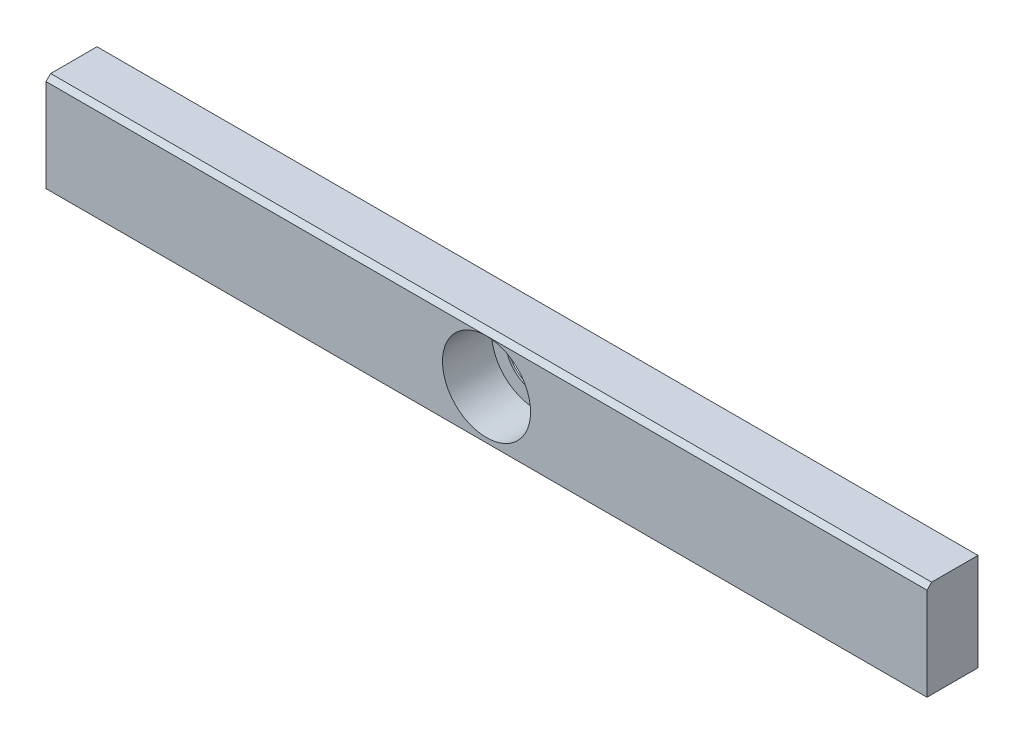
ISO-10303-21;
HEADER;
FILE_DESCRIPTION(('STEP AP214'),'2;1');
FILE_NAME('part.step','',(''),(''),'','','');
FILE_SCHEMA(('AUTOMOTIVE_DESIGN { 1 0 10303 214 1 1 1 1 }'));
ENDSEC;
DATA;
#1=APPLICATION_CONTEXT('core data for automotive mechanical design processes');
#2=APPLICATION_PROTOCOL_DEFINITION('international standard','automotive_design',2000,#1);
#3=PRODUCT_CONTEXT('',#1,'mechanical');
#4=PRODUCT('Part','Part','',(#3));
#5=PRODUCT_RELATED_PRODUCT_CATEGORY('part','',(#4));
#6=PRODUCT_DEFINITION_FORMATION('','',#4);
#7=PRODUCT_DEFINITION_CONTEXT('part definition',#1,'design');
#8=PRODUCT_DEFINITION('design','',#6,#7);
#9=PRODUCT_DEFINITION_SHAPE('','',#8);
#10=(LENGTH_UNIT() NAMED_UNIT(*) SI_UNIT(.MILLI.,.METRE.));
#11=(NAMED_UNIT(*) PLANE_ANGLE_UNIT() SI_UNIT($,.RADIAN.));
#12=(NAMED_UNIT(*) SI_UNIT($,.STERADIAN.) SOLID_ANGLE_UNIT());
#13=UNCERTAINTY_MEASURE_WITH_UNIT(LENGTH_MEASURE(1.E-05),#10,'distance_accuracy_value','');
#14=(GEOMETRIC_REPRESENTATION_CONTEXT(3) GLOBAL_UNCERTAINTY_ASSIGNED_CONTEXT((#13)) GLOBAL_UNIT_ASSIGNED_CONTEXT((#10,
#11,#12)) REPRESENTATION_CONTEXT('',''));
#15=CARTESIAN_POINT('',(0.,0.,0.));
#16=DIRECTION('',(0.,0.,1.));
#17=DIRECTION('',(1.,0.,0.));
#18=AXIS2_PLACEMENT_3D('',#15,#16,#17);
#19=CARTESIAN_POINT('',(475.,52.5,27.5));
#20=DIRECTION('',(-1.,0.,0.));
#21=DIRECTION('',(0.,0.,1.));
#22=AXIS2_PLACEMENT_3D('',#19,#20,#21);
#23=PLANE('',#22);
#24=DIRECTION('',(0.,0.,-1.));
#25=VECTOR('',#24,1.);
#26=CARTESIAN_POINT('',(475.,52.5,27.5));
#27=LINE('',#26,#25);
#28=CARTESIAN_POINT('',(475.,52.5,22.5));
#29=VERTEX_POINT('',#28);
#30=CARTESIAN_POINT('',(475.,52.5,-27.5));
#31=VERTEX_POINT('',#30);
#32=EDGE_CURVE('E122',#29,#31,#27,.T.);
#33=ORIENTED_EDGE('',*,*,#32,.F.);
#34=DIRECTION('',(0.,-0.70710678118654,0.707106781186555));
#35=VECTOR('',#34,1.);
#36=CARTESIAN_POINT('',(475.,47.5000000000001,27.5));
#37=LINE('',#36,#35);
#38=CARTESIAN_POINT('',(475.,47.5000000000001,27.5));
#39=VERTEX_POINT('',#38);
#40=EDGE_CURVE('E11',#29,#39,#37,.T.);
#41=ORIENTED_EDGE('',*,*,#40,.T.);
#42=DIRECTION('',(0.,1.,0.));
#43=VECTOR('',#42,1.);
#44=CARTESIAN_POINT('',(475.,52.5,27.5));
#45=LINE('',#44,#43);
#46=CARTESIAN_POINT('',(475.,-52.5,27.5));
#47=VERTEX_POINT('',#46);
#48=EDGE_CURVE('E92',#47,#39,#45,.T.);
#49=ORIENTED_EDGE('',*,*,#48,.F.);
#50=DIRECTION('',(0.,0.,-1.));
#51=VECTOR('',#50,1.);
#52=CARTESIAN_POINT('',(475.,-52.5,27.5));
#53=LINE('',#52,#51);
#54=CARTESIAN_POINT('',(475.,-52.5,-27.5));
#55=VERTEX_POINT('',#54);
#56=EDGE_CURVE('E102',#47,#55,#53,.T.);
#57=ORIENTED_EDGE('',*,*,#56,.T.);
#58=DIRECTION('',(0.,1.,0.));
#59=VECTOR('',#58,1.);
#60=CARTESIAN_POINT('',(475.,52.5,-27.5));
#61=LINE('',#60,#59);
#62=EDGE_CURVE('E111',#55,#31,#61,.T.);
#63=ORIENTED_EDGE('',*,*,#62,.T.);
#64=EDGE_LOOP('',(#33,#41,#49,#57,#63));
#65=FACE_BOUND('',#64,.T.);
#66=ADVANCED_FACE('F35',(#65),#23,.F.);
#67=CARTESIAN_POINT('',(-475.,52.5,27.5));
#68=DIRECTION('',(0.,-1.,0.));
#69=DIRECTION('',(0.,0.,-1.));
#70=AXIS2_PLACEMENT_3D('',#67,#68,#69);
#71=PLANE('',#70);
#72=DIRECTION('',(0.,0.,-1.));
#73=VECTOR('',#72,1.);
#74=CARTESIAN_POINT('',(-475.,52.5,27.5));
#75=LINE('',#74,#73);
#76=CARTESIAN_POINT('',(-475.,52.5,22.5));
#77=VERTEX_POINT('',#76);
#78=CARTESIAN_POINT('',(-475.,52.5,-27.5));
#79=VERTEX_POINT('',#78);
#80=EDGE_CURVE('E101',#77,#79,#75,.T.);
#81=ORIENTED_EDGE('',*,*,#80,.F.);
#82=DIRECTION('',(1.,0.,0.));
#83=VECTOR('',#82,1.);
#84=CARTESIAN_POINT('',(475.,52.5,22.5));
#85=LINE('',#84,#83);
#86=EDGE_CURVE('E44',#77,#29,#85,.T.);
#87=ORIENTED_EDGE('',*,*,#86,.T.);
#88=ORIENTED_EDGE('',*,*,#32,.T.);
#89=DIRECTION('',(-1.,0.,0.));
#90=VECTOR('',#89,1.);
#91=CARTESIAN_POINT('',(-475.,52.5,-27.5));
#92=LINE('',#91,#90);
#93=EDGE_CURVE('E114',#31,#79,#92,.T.);
#94=ORIENTED_EDGE('',*,*,#93,.T.);
#95=EDGE_LOOP('',(#81,#87,#88,#94));
#96=FACE_BOUND('',#95,.T.);
#97=ADVANCED_FACE('F164',(#96),#71,.F.);
#98=CARTESIAN_POINT('',(-475.,52.5,27.5));
#99=DIRECTION('',(1.,0.,0.));
#100=DIRECTION('',(0.,0.,-1.));
#101=AXIS2_PLACEMENT_3D('',#98,#99,#100);
#102=PLANE('',#101);
#103=DIRECTION('',(0.,-1.,0.));
#104=VECTOR('',#103,1.);
#105=CARTESIAN_POINT('',(-475.,52.5,27.5));
#106=LINE('',#105,#104);
#107=CARTESIAN_POINT('',(-475.,47.5000000000001,27.5));
#108=VERTEX_POINT('',#107);
#109=CARTESIAN_POINT('',(-475.,-52.5,27.5));
#110=VERTEX_POINT('',#109);
#111=EDGE_CURVE('E83',#108,#110,#106,.T.);
#112=ORIENTED_EDGE('',*,*,#111,.F.);
#113=DIRECTION('',(0.,0.70710678118654,-0.707106781186555));
#114=VECTOR('',#113,1.);
#115=CARTESIAN_POINT('',(-475.,47.5000000000001,27.5));
#116=LINE('',#115,#114);
#117=EDGE_CURVE('E58',#108,#77,#116,.T.);
#118=ORIENTED_EDGE('',*,*,#117,.T.);
#119=ORIENTED_EDGE('',*,*,#80,.T.);
#120=DIRECTION('',(0.,-1.,0.));
#121=VECTOR('',#120,1.);
#122=CARTESIAN_POINT('',(-475.,52.5,-27.5));
#123=LINE('',#122,#121);
#124=CARTESIAN_POINT('',(-475.,-52.5,-27.5));
#125=VERTEX_POINT('',#124);
#126=EDGE_CURVE('E98',#79,#125,#123,.T.);
#127=ORIENTED_EDGE('',*,*,#126,.T.);
#128=DIRECTION('',(0.,0.,-1.));
#129=VECTOR('',#128,1.);
#130=CARTESIAN_POINT('',(-475.,-52.5,27.5));
#131=LINE('',#130,#129);
#132=EDGE_CURVE('E95',#110,#125,#131,.T.);
#133=ORIENTED_EDGE('',*,*,#132,.F.);
#134=EDGE_LOOP('',(#112,#118,#119,#127,#133));
#135=FACE_BOUND('',#134,.T.);
#136=ADVANCED_FACE('F96',(#135),#102,.F.);
#137=CARTESIAN_POINT('',(-475.,-52.5,27.5));
#138=DIRECTION('',(0.,1.,0.));
#139=DIRECTION('',(0.,0.,1.));
#140=AXIS2_PLACEMENT_3D('',#137,#138,#139);
#141=PLANE('',#140);
#142=DIRECTION('',(1.,0.,0.));
#143=VECTOR('',#142,1.);
#144=CARTESIAN_POINT('',(-475.,-52.5,-27.5));
#145=LINE('',#144,#143);
#146=EDGE_CURVE('E119',#125,#55,#145,.T.);
#147=ORIENTED_EDGE('',*,*,#146,.T.);
#148=ORIENTED_EDGE('',*,*,#56,.F.);
#149=DIRECTION('',(1.,0.,0.));
#150=VECTOR('',#149,1.);
#151=CARTESIAN_POINT('',(-475.,-52.5,27.5));
#152=LINE('',#151,#150);
#153=EDGE_CURVE('E88',#110,#47,#152,.T.);
#154=ORIENTED_EDGE('',*,*,#153,.F.);
#155=ORIENTED_EDGE('',*,*,#132,.T.);
#156=EDGE_LOOP('',(#147,#148,#154,#155));
#157=FACE_BOUND('',#156,.T.);
#158=ADVANCED_FACE('F104',(#157),#141,.F.);
#159=CARTESIAN_POINT('',(0.,0.,27.5));
#160=DIRECTION('',(0.,0.,1.));
#161=DIRECTION('',(1.,0.,0.));
#162=AXIS2_PLACEMENT_3D('',#159,#160,#161);
#163=PLANE('',#162);
#164=ORIENTED_EDGE('',*,*,#48,.T.);
#165=DIRECTION('',(-1.,0.,0.));
#166=VECTOR('',#165,1.);
#167=CARTESIAN_POINT('',(-475.,47.5000000000001,27.5));
#168=LINE('',#167,#166);
#169=CARTESIAN_POINT('',(0.,47.5000000000001,27.5));
#170=VERTEX_POINT('',#169);
#171=EDGE_CURVE('E125',#39,#170,#168,.T.);
#172=ORIENTED_EDGE('',*,*,#171,.T.);
#173=CARTESIAN_POINT('',(0.,0.,27.5));
#174=DIRECTION('',(0.,0.,1.));
#175=DIRECTION('',(1.,0.,0.));
#176=AXIS2_PLACEMENT_3D('',#173,#174,#175);
#177=CIRCLE('',#176,47.5);
#178=EDGE_CURVE('E130',#170,#170,#177,.T.);
#179=ORIENTED_EDGE('',*,*,#178,.F.);
#180=DIRECTION('',(-1.,0.,0.));
#181=VECTOR('',#180,1.);
#182=CARTESIAN_POINT('',(-475.,47.5000000000001,27.5));
#183=LINE('',#182,#181);
#184=EDGE_CURVE('E91',#170,#108,#183,.T.);
#185=ORIENTED_EDGE('',*,*,#184,.T.);
#186=ORIENTED_EDGE('',*,*,#111,.T.);
#187=ORIENTED_EDGE('',*,*,#153,.T.);
#188=EDGE_LOOP('',(#164,#172,#179,#185,#186,#187));
#189=FACE_BOUND('',#188,.T.);
#190=ADVANCED_FACE('F86',(#189),#163,.T.);
#191=CARTESIAN_POINT('',(0.,0.,-27.5));
#192=DIRECTION('',(0.,0.,1.));
#193=DIRECTION('',(1.,0.,0.));
#194=AXIS2_PLACEMENT_3D('',#191,#192,#193);
#195=PLANE('',#194);
#196=CARTESIAN_POINT('',(0.,0.,-27.5));
#197=DIRECTION('',(0.,0.,1.));
#198=DIRECTION('',(1.,0.,0.));
#199=AXIS2_PLACEMENT_3D('',#196,#197,#198);
#200=CIRCLE('',#199,32.5);
#201=CARTESIAN_POINT('',(32.5,0.,-27.5));
#202=VERTEX_POINT('',#201);
#203=EDGE_CURVE('E135',#202,#202,#200,.T.);
#204=ORIENTED_EDGE('',*,*,#203,.T.);
#205=EDGE_LOOP('',(#204));
#206=FACE_BOUND('',#205,.T.);
#207=ORIENTED_EDGE('',*,*,#62,.F.);
#208=ORIENTED_EDGE('',*,*,#146,.F.);
#209=ORIENTED_EDGE('',*,*,#126,.F.);
#210=ORIENTED_EDGE('',*,*,#93,.F.);
#211=EDGE_LOOP('',(#207,#208,#209,#210));
#212=FACE_BOUND('',#211,.T.);
#213=ADVANCED_FACE('F155',(#206,#212),#195,.F.);
#214=CARTESIAN_POINT('',(0.,0.,-25.5));
#215=DIRECTION('',(0.,0.,1.));
#216=DIRECTION('',(1.,0.,0.));
#217=AXIS2_PLACEMENT_3D('',#214,#215,#216);
#218=CYLINDRICAL_SURFACE('',#217,47.5);
#219=CARTESIAN_POINT('',(0.,0.,-25.5));
#220=DIRECTION('',(0.,0.,1.));
#221=DIRECTION('',(1.,0.,0.));
#222=AXIS2_PLACEMENT_3D('',#219,#220,#221);
#223=CIRCLE('',#222,47.5);
#224=CARTESIAN_POINT('',(47.5,0.,-25.5));
#225=VERTEX_POINT('',#224);
#226=EDGE_CURVE('E115',#225,#225,#223,.T.);
#227=ORIENTED_EDGE('',*,*,#226,.F.);
#228=EDGE_LOOP('',(#227));
#229=FACE_BOUND('',#228,.T.);
#230=ORIENTED_EDGE('',*,*,#178,.T.);
#231=EDGE_LOOP('',(#230));
#232=FACE_BOUND('',#231,.T.);
#233=ADVANCED_FACE('F134',(#229,#232),#218,.F.);
#234=CARTESIAN_POINT('',(0.,0.,-25.5));
#235=DIRECTION('',(0.,0.,1.));
#236=DIRECTION('',(1.,0.,0.));
#237=AXIS2_PLACEMENT_3D('',#234,#235,#236);
#238=PLANE('',#237);
#239=CARTESIAN_POINT('',(0.,0.,-25.5));
#240=DIRECTION('',(0.,0.,1.));
#241=DIRECTION('',(1.,0.,0.));
#242=AXIS2_PLACEMENT_3D('',#239,#240,#241);
#243=CIRCLE('',#242,32.5);
#244=CARTESIAN_POINT('',(32.5,0.,-25.5));
#245=VERTEX_POINT('',#244);
#246=EDGE_CURVE('E140',#245,#245,#243,.T.);
#247=ORIENTED_EDGE('',*,*,#246,.F.);
#248=EDGE_LOOP('',(#247));
#249=FACE_BOUND('',#248,.T.);
#250=ORIENTED_EDGE('',*,*,#226,.T.);
#251=EDGE_LOOP('',(#250));
#252=FACE_BOUND('',#251,.T.);
#253=ADVANCED_FACE('F148',(#249,#252),#238,.T.);
#254=CARTESIAN_POINT('',(0.,0.,-27.5));
#255=DIRECTION('',(0.,0.,1.));
#256=DIRECTION('',(1.,0.,0.));
#257=AXIS2_PLACEMENT_3D('',#254,#255,#256);
#258=CYLINDRICAL_SURFACE('',#257,32.5);
#259=ORIENTED_EDGE('',*,*,#203,.F.);
#260=EDGE_LOOP('',(#259));
#261=FACE_BOUND('',#260,.T.);
#262=ORIENTED_EDGE('',*,*,#246,.T.);
#263=EDGE_LOOP('',(#262));
#264=FACE_BOUND('',#263,.T.);
#265=ADVANCED_FACE('F146',(#261,#264),#258,.F.);
#266=CARTESIAN_POINT('',(0.,47.5000000000001,27.5));
#267=DIRECTION('',(0.,0.707106781186555,0.70710678118654));
#268=DIRECTION('',(1.,0.,0.));
#269=AXIS2_PLACEMENT_3D('',#266,#267,#268);
#270=PLANE('',#269);
#271=ORIENTED_EDGE('',*,*,#40,.F.);
#272=ORIENTED_EDGE('',*,*,#86,.F.);
#273=ORIENTED_EDGE('',*,*,#117,.F.);
#274=ORIENTED_EDGE('',*,*,#184,.F.);
#275=ORIENTED_EDGE('',*,*,#171,.F.);
#276=EDGE_LOOP('',(#271,#272,#273,#274,#275));
#277=FACE_BOUND('',#276,.T.);
#278=ADVANCED_FACE('F38',(#277),#270,.T.);
#279=CLOSED_SHELL('',(#66,#97,#136,#158,#190,#213,#233,#253,#265,#278));
#280=MANIFOLD_SOLID_BREP('B2',#279);
#281=ADVANCED_BREP_SHAPE_REPRESENTATION('',(#18,#280),#14);
#282=SHAPE_DEFINITION_REPRESENTATION(#9,#281);
ENDSEC;
END-ISO-10303-21;
